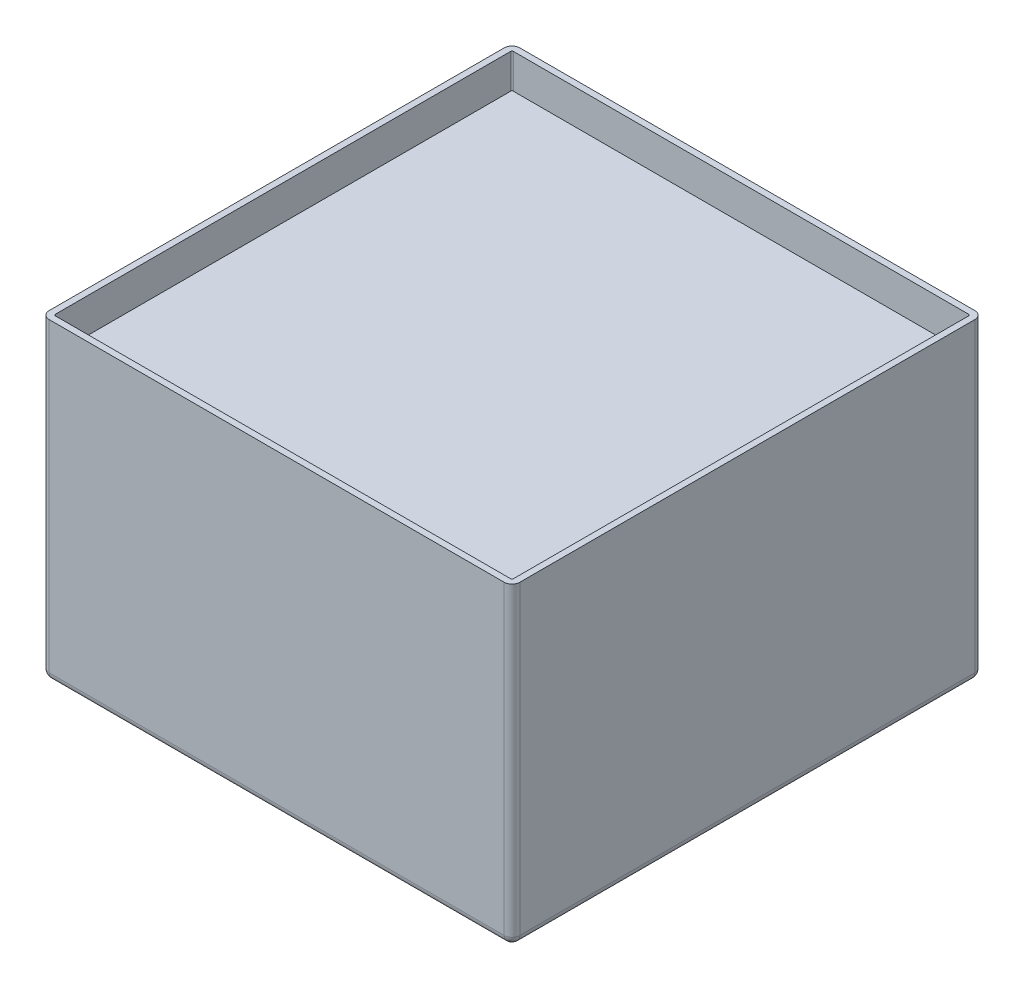
ISO-10303-21;
HEADER;
FILE_DESCRIPTION(('STEP AP214'),'2;1');
FILE_NAME('part.step','',(''),(''),'','','');
FILE_SCHEMA(('AUTOMOTIVE_DESIGN { 1 0 10303 214 1 1 1 1 }'));
ENDSEC;
DATA;
#1=APPLICATION_CONTEXT('core data for automotive mechanical design processes');
#2=APPLICATION_PROTOCOL_DEFINITION('international standard','automotive_design',2000,#1);
#3=PRODUCT_CONTEXT('',#1,'mechanical');
#4=PRODUCT('Part','Part','',(#3));
#5=PRODUCT_RELATED_PRODUCT_CATEGORY('part','',(#4));
#6=PRODUCT_DEFINITION_FORMATION('','',#4);
#7=PRODUCT_DEFINITION_CONTEXT('part definition',#1,'design');
#8=PRODUCT_DEFINITION('design','',#6,#7);
#9=PRODUCT_DEFINITION_SHAPE('','',#8);
#10=(LENGTH_UNIT() NAMED_UNIT(*) SI_UNIT(.MILLI.,.METRE.));
#11=(NAMED_UNIT(*) PLANE_ANGLE_UNIT() SI_UNIT($,.RADIAN.));
#12=(NAMED_UNIT(*) SI_UNIT($,.STERADIAN.) SOLID_ANGLE_UNIT());
#13=UNCERTAINTY_MEASURE_WITH_UNIT(LENGTH_MEASURE(1.E-05),#10,'distance_accuracy_value','');
#14=(GEOMETRIC_REPRESENTATION_CONTEXT(3) GLOBAL_UNCERTAINTY_ASSIGNED_CONTEXT((#13)) GLOBAL_UNIT_ASSIGNED_CONTEXT((#10,
#11,#12)) REPRESENTATION_CONTEXT('',''));
#15=CARTESIAN_POINT('',(0.,0.,0.));
#16=DIRECTION('',(0.,0.,1.));
#17=DIRECTION('',(1.,0.,0.));
#18=AXIS2_PLACEMENT_3D('',#15,#16,#17);
#19=CARTESIAN_POINT('',(-290.,358.,290.));
#20=DIRECTION('',(0.,0.,-1.));
#21=DIRECTION('',(-1.,0.,0.));
#22=AXIS2_PLACEMENT_3D('',#19,#20,#21);
#23=PLANE('',#22);
#24=DIRECTION('',(1.,0.,0.));
#25=VECTOR('',#24,1.);
#26=CARTESIAN_POINT('',(-290.,8.,290.));
#27=LINE('',#26,#25);
#28=CARTESIAN_POINT('',(-290.,8.,290.));
#29=VERTEX_POINT('',#28);
#30=CARTESIAN_POINT('',(290.,8.,290.));
#31=VERTEX_POINT('',#30);
#32=EDGE_CURVE('E108',#29,#31,#27,.T.);
#33=ORIENTED_EDGE('',*,*,#32,.T.);
#34=DIRECTION('',(0.,-1.,0.));
#35=VECTOR('',#34,1.);
#36=CARTESIAN_POINT('',(290.,358.,290.));
#37=LINE('',#36,#35);
#38=CARTESIAN_POINT('',(290.,358.,290.));
#39=VERTEX_POINT('',#38);
#40=EDGE_CURVE('E12',#39,#31,#37,.T.);
#41=ORIENTED_EDGE('',*,*,#40,.F.);
#42=DIRECTION('',(1.,0.,0.));
#43=VECTOR('',#42,1.);
#44=CARTESIAN_POINT('',(-290.,358.,290.));
#45=LINE('',#44,#43);
#46=CARTESIAN_POINT('',(-290.,358.,290.));
#47=VERTEX_POINT('',#46);
#48=EDGE_CURVE('E96',#47,#39,#45,.T.);
#49=ORIENTED_EDGE('',*,*,#48,.F.);
#50=DIRECTION('',(0.,-1.,0.));
#51=VECTOR('',#50,1.);
#52=CARTESIAN_POINT('',(-290.,358.,290.));
#53=LINE('',#52,#51);
#54=EDGE_CURVE('E104',#47,#29,#53,.T.);
#55=ORIENTED_EDGE('',*,*,#54,.T.);
#56=EDGE_LOOP('',(#33,#41,#49,#55));
#57=FACE_BOUND('',#56,.T.);
#58=ADVANCED_FACE('F45',(#57),#23,.F.);
#59=CARTESIAN_POINT('',(290.,358.,290.));
#60=DIRECTION('',(-1.,0.,0.));
#61=DIRECTION('',(0.,0.,1.));
#62=AXIS2_PLACEMENT_3D('',#59,#60,#61);
#63=PLANE('',#62);
#64=DIRECTION('',(0.,0.,-1.));
#65=VECTOR('',#64,1.);
#66=CARTESIAN_POINT('',(290.,8.,290.));
#67=LINE('',#66,#65);
#68=CARTESIAN_POINT('',(290.,8.,-290.));
#69=VERTEX_POINT('',#68);
#70=EDGE_CURVE('E100',#31,#69,#67,.T.);
#71=ORIENTED_EDGE('',*,*,#70,.T.);
#72=DIRECTION('',(0.,-1.,0.));
#73=VECTOR('',#72,1.);
#74=CARTESIAN_POINT('',(290.,358.,-290.));
#75=LINE('',#74,#73);
#76=CARTESIAN_POINT('',(290.,358.,-290.));
#77=VERTEX_POINT('',#76);
#78=EDGE_CURVE('E53',#77,#69,#75,.T.);
#79=ORIENTED_EDGE('',*,*,#78,.F.);
#80=DIRECTION('',(0.,0.,-1.));
#81=VECTOR('',#80,1.);
#82=CARTESIAN_POINT('',(290.,358.,290.));
#83=LINE('',#82,#81);
#84=EDGE_CURVE('E91',#39,#77,#83,.T.);
#85=ORIENTED_EDGE('',*,*,#84,.F.);
#86=ORIENTED_EDGE('',*,*,#40,.T.);
#87=EDGE_LOOP('',(#71,#79,#85,#86));
#88=FACE_BOUND('',#87,.T.);
#89=ADVANCED_FACE('F99',(#88),#63,.F.);
#90=CARTESIAN_POINT('',(290.,358.,-290.));
#91=DIRECTION('',(0.,0.,1.));
#92=DIRECTION('',(1.,0.,0.));
#93=AXIS2_PLACEMENT_3D('',#90,#91,#92);
#94=PLANE('',#93);
#95=DIRECTION('',(-1.,0.,0.));
#96=VECTOR('',#95,1.);
#97=CARTESIAN_POINT('',(290.,8.,-290.));
#98=LINE('',#97,#96);
#99=CARTESIAN_POINT('',(-290.,8.,-290.));
#100=VERTEX_POINT('',#99);
#101=EDGE_CURVE('E78',#69,#100,#98,.T.);
#102=ORIENTED_EDGE('',*,*,#101,.T.);
#103=DIRECTION('',(0.,-1.,0.));
#104=VECTOR('',#103,1.);
#105=CARTESIAN_POINT('',(-290.,358.,-290.));
#106=LINE('',#105,#104);
#107=CARTESIAN_POINT('',(-290.,358.,-290.));
#108=VERTEX_POINT('',#107);
#109=EDGE_CURVE('E101',#108,#100,#106,.T.);
#110=ORIENTED_EDGE('',*,*,#109,.F.);
#111=DIRECTION('',(-1.,0.,0.));
#112=VECTOR('',#111,1.);
#113=CARTESIAN_POINT('',(290.,358.,-290.));
#114=LINE('',#113,#112);
#115=EDGE_CURVE('E94',#77,#108,#114,.T.);
#116=ORIENTED_EDGE('',*,*,#115,.F.);
#117=ORIENTED_EDGE('',*,*,#78,.T.);
#118=EDGE_LOOP('',(#102,#110,#116,#117));
#119=FACE_BOUND('',#118,.T.);
#120=ADVANCED_FACE('F102',(#119),#94,.F.);
#121=CARTESIAN_POINT('',(-290.,358.,-290.));
#122=DIRECTION('',(1.,0.,0.));
#123=DIRECTION('',(0.,0.,-1.));
#124=AXIS2_PLACEMENT_3D('',#121,#122,#123);
#125=PLANE('',#124);
#126=DIRECTION('',(0.,0.,1.));
#127=VECTOR('',#126,1.);
#128=CARTESIAN_POINT('',(-290.,8.,-290.));
#129=LINE('',#128,#127);
#130=EDGE_CURVE('E84',#100,#29,#129,.T.);
#131=ORIENTED_EDGE('',*,*,#130,.T.);
#132=ORIENTED_EDGE('',*,*,#54,.F.);
#133=DIRECTION('',(0.,0.,1.));
#134=VECTOR('',#133,1.);
#135=CARTESIAN_POINT('',(-290.,358.,-290.));
#136=LINE('',#135,#134);
#137=EDGE_CURVE('E61',#108,#47,#136,.T.);
#138=ORIENTED_EDGE('',*,*,#137,.F.);
#139=ORIENTED_EDGE('',*,*,#109,.T.);
#140=EDGE_LOOP('',(#131,#132,#138,#139));
#141=FACE_BOUND('',#140,.T.);
#142=ADVANCED_FACE('F115',(#141),#125,.F.);
#143=CARTESIAN_POINT('',(290.,358.,290.));
#144=DIRECTION('',(0.,1.,0.));
#145=DIRECTION('',(0.,0.,1.));
#146=AXIS2_PLACEMENT_3D('',#143,#144,#145);
#147=PLANE('',#146);
#148=ORIENTED_EDGE('',*,*,#48,.T.);
#149=ORIENTED_EDGE('',*,*,#84,.T.);
#150=ORIENTED_EDGE('',*,*,#115,.T.);
#151=ORIENTED_EDGE('',*,*,#137,.T.);
#152=EDGE_LOOP('',(#148,#149,#150,#151));
#153=FACE_BOUND('',#152,.T.);
#154=ADVANCED_FACE('F92',(#153),#147,.T.);
#155=CARTESIAN_POINT('',(290.,8.,290.));
#156=DIRECTION('',(0.,1.,0.));
#157=DIRECTION('',(0.,0.,1.));
#158=AXIS2_PLACEMENT_3D('',#155,#156,#157);
#159=PLANE('',#158);
#160=ORIENTED_EDGE('',*,*,#32,.F.);
#161=ORIENTED_EDGE('',*,*,#130,.F.);
#162=ORIENTED_EDGE('',*,*,#101,.F.);
#163=ORIENTED_EDGE('',*,*,#70,.F.);
#164=EDGE_LOOP('',(#160,#161,#162,#163));
#165=FACE_BOUND('',#164,.T.);
#166=ADVANCED_FACE('F118',(#165),#159,.F.);
#167=CLOSED_SHELL('',(#58,#89,#120,#142,#154,#166));
#168=MANIFOLD_SOLID_BREP('B2',#167);
#169=CARTESIAN_POINT('',(-300.,400.,300.));
#170=DIRECTION('',(1.,0.,0.));
#171=DIRECTION('',(0.,0.,-1.));
#172=AXIS2_PLACEMENT_3D('',#169,#170,#171);
#173=PLANE('',#172);
#174=DIRECTION('',(0.,0.,1.));
#175=VECTOR('',#174,1.);
#176=CARTESIAN_POINT('',(-300.,400.,300.));
#177=LINE('',#176,#175);
#178=CARTESIAN_POINT('',(-300.,400.,-290.));
#179=VERTEX_POINT('',#178);
#180=CARTESIAN_POINT('',(-300.,400.,290.));
#181=VERTEX_POINT('',#180);
#182=EDGE_CURVE('E414',#179,#181,#177,.T.);
#183=ORIENTED_EDGE('',*,*,#182,.F.);
#184=DIRECTION('',(0.,-1.,0.));
#185=VECTOR('',#184,1.);
#186=CARTESIAN_POINT('',(-300.,400.,-290.));
#187=LINE('',#186,#185);
#188=CARTESIAN_POINT('',(-300.,10.,-290.));
#189=VERTEX_POINT('',#188);
#190=EDGE_CURVE('E194',#179,#189,#187,.T.);
#191=ORIENTED_EDGE('',*,*,#190,.T.);
#192=DIRECTION('',(0.,0.,1.));
#193=VECTOR('',#192,1.);
#194=CARTESIAN_POINT('',(-300.,10.,300.));
#195=LINE('',#194,#193);
#196=CARTESIAN_POINT('',(-300.,10.,290.));
#197=VERTEX_POINT('',#196);
#198=EDGE_CURVE('E456',#189,#197,#195,.T.);
#199=ORIENTED_EDGE('',*,*,#198,.T.);
#200=DIRECTION('',(0.,-1.,0.));
#201=VECTOR('',#200,1.);
#202=CARTESIAN_POINT('',(-300.,400.,290.));
#203=LINE('',#202,#201);
#204=EDGE_CURVE('E454',#197,#181,#203,.F.);
#205=ORIENTED_EDGE('',*,*,#204,.T.);
#206=EDGE_LOOP('',(#183,#191,#199,#205));
#207=FACE_BOUND('',#206,.T.);
#208=ADVANCED_FACE('F169',(#207),#173,.F.);
#209=CARTESIAN_POINT('',(300.,400.,300.));
#210=DIRECTION('',(0.,0.,-1.));
#211=DIRECTION('',(-1.,0.,0.));
#212=AXIS2_PLACEMENT_3D('',#209,#210,#211);
#213=PLANE('',#212);
#214=DIRECTION('',(1.,0.,0.));
#215=VECTOR('',#214,1.);
#216=CARTESIAN_POINT('',(300.,10.,300.));
#217=LINE('',#216,#215);
#218=CARTESIAN_POINT('',(-290.,10.,300.));
#219=VERTEX_POINT('',#218);
#220=CARTESIAN_POINT('',(290.,10.,300.));
#221=VERTEX_POINT('',#220);
#222=EDGE_CURVE('E428',#219,#221,#217,.T.);
#223=ORIENTED_EDGE('',*,*,#222,.T.);
#224=DIRECTION('',(0.,-1.,0.));
#225=VECTOR('',#224,1.);
#226=CARTESIAN_POINT('',(290.,400.,300.));
#227=LINE('',#226,#225);
#228=CARTESIAN_POINT('',(290.,400.,300.));
#229=VERTEX_POINT('',#228);
#230=EDGE_CURVE('E431',#221,#229,#227,.F.);
#231=ORIENTED_EDGE('',*,*,#230,.T.);
#232=DIRECTION('',(1.,0.,0.));
#233=VECTOR('',#232,1.);
#234=CARTESIAN_POINT('',(300.,400.,300.));
#235=LINE('',#234,#233);
#236=CARTESIAN_POINT('',(-290.,400.,300.));
#237=VERTEX_POINT('',#236);
#238=EDGE_CURVE('E417',#237,#229,#235,.T.);
#239=ORIENTED_EDGE('',*,*,#238,.F.);
#240=DIRECTION('',(0.,-1.,0.));
#241=VECTOR('',#240,1.);
#242=CARTESIAN_POINT('',(-290.,400.,300.));
#243=LINE('',#242,#241);
#244=EDGE_CURVE('E426',#237,#219,#243,.T.);
#245=ORIENTED_EDGE('',*,*,#244,.T.);
#246=EDGE_LOOP('',(#223,#231,#239,#245));
#247=FACE_BOUND('',#246,.T.);
#248=ADVANCED_FACE('F517',(#247),#213,.F.);
#249=CARTESIAN_POINT('',(300.,400.,300.));
#250=DIRECTION('',(-1.,0.,0.));
#251=DIRECTION('',(0.,0.,1.));
#252=AXIS2_PLACEMENT_3D('',#249,#250,#251);
#253=PLANE('',#252);
#254=DIRECTION('',(0.,0.,-1.));
#255=VECTOR('',#254,1.);
#256=CARTESIAN_POINT('',(300.,10.,300.));
#257=LINE('',#256,#255);
#258=CARTESIAN_POINT('',(300.,10.,290.));
#259=VERTEX_POINT('',#258);
#260=CARTESIAN_POINT('',(300.,10.,-290.));
#261=VERTEX_POINT('',#260);
#262=EDGE_CURVE('E444',#259,#261,#257,.T.);
#263=ORIENTED_EDGE('',*,*,#262,.T.);
#264=DIRECTION('',(0.,-1.,0.));
#265=VECTOR('',#264,1.);
#266=CARTESIAN_POINT('',(300.,400.,-290.));
#267=LINE('',#266,#265);
#268=CARTESIAN_POINT('',(300.,400.,-290.));
#269=VERTEX_POINT('',#268);
#270=EDGE_CURVE('E446',#261,#269,#267,.F.);
#271=ORIENTED_EDGE('',*,*,#270,.T.);
#272=DIRECTION('',(0.,0.,-1.));
#273=VECTOR('',#272,1.);
#274=CARTESIAN_POINT('',(300.,400.,300.));
#275=LINE('',#274,#273);
#276=CARTESIAN_POINT('',(300.,400.,290.));
#277=VERTEX_POINT('',#276);
#278=EDGE_CURVE('E420',#277,#269,#275,.T.);
#279=ORIENTED_EDGE('',*,*,#278,.F.);
#280=DIRECTION('',(0.,-1.,0.));
#281=VECTOR('',#280,1.);
#282=CARTESIAN_POINT('',(300.,400.,290.));
#283=LINE('',#282,#281);
#284=EDGE_CURVE('E442',#277,#259,#283,.T.);
#285=ORIENTED_EDGE('',*,*,#284,.T.);
#286=EDGE_LOOP('',(#263,#271,#279,#285));
#287=FACE_BOUND('',#286,.T.);
#288=ADVANCED_FACE('F527',(#287),#253,.F.);
#289=CARTESIAN_POINT('',(300.,400.,-300.));
#290=DIRECTION('',(0.,0.,1.));
#291=DIRECTION('',(1.,0.,0.));
#292=AXIS2_PLACEMENT_3D('',#289,#290,#291);
#293=PLANE('',#292);
#294=DIRECTION('',(-1.,0.,0.));
#295=VECTOR('',#294,1.);
#296=CARTESIAN_POINT('',(300.,10.,-300.));
#297=LINE('',#296,#295);
#298=CARTESIAN_POINT('',(290.,10.,-300.));
#299=VERTEX_POINT('',#298);
#300=CARTESIAN_POINT('',(-290.,10.,-300.));
#301=VERTEX_POINT('',#300);
#302=EDGE_CURVE('E450',#299,#301,#297,.T.);
#303=ORIENTED_EDGE('',*,*,#302,.T.);
#304=DIRECTION('',(0.,-1.,0.));
#305=VECTOR('',#304,1.);
#306=CARTESIAN_POINT('',(-290.,400.,-300.));
#307=LINE('',#306,#305);
#308=CARTESIAN_POINT('',(-290.,400.,-300.));
#309=VERTEX_POINT('',#308);
#310=EDGE_CURVE('E452',#301,#309,#307,.F.);
#311=ORIENTED_EDGE('',*,*,#310,.T.);
#312=DIRECTION('',(-1.,0.,0.));
#313=VECTOR('',#312,1.);
#314=CARTESIAN_POINT('',(300.,400.,-300.));
#315=LINE('',#314,#313);
#316=CARTESIAN_POINT('',(290.,400.,-300.));
#317=VERTEX_POINT('',#316);
#318=EDGE_CURVE('E423',#317,#309,#315,.T.);
#319=ORIENTED_EDGE('',*,*,#318,.F.);
#320=DIRECTION('',(0.,-1.,0.));
#321=VECTOR('',#320,1.);
#322=CARTESIAN_POINT('',(290.,400.,-300.));
#323=LINE('',#322,#321);
#324=EDGE_CURVE('E448',#317,#299,#323,.T.);
#325=ORIENTED_EDGE('',*,*,#324,.T.);
#326=EDGE_LOOP('',(#303,#311,#319,#325));
#327=FACE_BOUND('',#326,.T.);
#328=ADVANCED_FACE('F548',(#327),#293,.F.);
#329=CARTESIAN_POINT('',(-300.,400.,-300.));
#330=DIRECTION('',(0.,1.,0.));
#331=DIRECTION('',(0.,0.,1.));
#332=AXIS2_PLACEMENT_3D('',#329,#330,#331);
#333=PLANE('',#332);
#334=DIRECTION('',(-1.,0.,0.));
#335=VECTOR('',#334,1.);
#336=CARTESIAN_POINT('',(300.,400.,-292.));
#337=LINE('',#336,#335);
#338=CARTESIAN_POINT('',(290.,400.,-292.));
#339=VERTEX_POINT('',#338);
#340=CARTESIAN_POINT('',(-290.,400.,-292.));
#341=VERTEX_POINT('',#340);
#342=EDGE_CURVE('E387',#339,#341,#337,.T.);
#343=ORIENTED_EDGE('',*,*,#342,.F.);
#344=CARTESIAN_POINT('',(290.,400.,-290.));
#345=DIRECTION('',(0.,1.,0.));
#346=DIRECTION('',(0.,0.,1.));
#347=AXIS2_PLACEMENT_3D('',#344,#345,#346);
#348=CIRCLE('',#347,2.);
#349=CARTESIAN_POINT('',(292.,400.,-290.));
#350=VERTEX_POINT('',#349);
#351=EDGE_CURVE('E407',#350,#339,#348,.T.);
#352=ORIENTED_EDGE('',*,*,#351,.F.);
#353=DIRECTION('',(0.,0.,-1.));
#354=VECTOR('',#353,1.);
#355=CARTESIAN_POINT('',(292.,400.,300.));
#356=LINE('',#355,#354);
#357=CARTESIAN_POINT('',(292.,400.,290.));
#358=VERTEX_POINT('',#357);
#359=EDGE_CURVE('E186',#358,#350,#356,.T.);
#360=ORIENTED_EDGE('',*,*,#359,.F.);
#361=CARTESIAN_POINT('',(290.,400.,290.));
#362=DIRECTION('',(0.,1.,0.));
#363=DIRECTION('',(0.,0.,1.));
#364=AXIS2_PLACEMENT_3D('',#361,#362,#363);
#365=CIRCLE('',#364,2.);
#366=CARTESIAN_POINT('',(290.,400.,292.));
#367=VERTEX_POINT('',#366);
#368=EDGE_CURVE('E403',#367,#358,#365,.T.);
#369=ORIENTED_EDGE('',*,*,#368,.F.);
#370=DIRECTION('',(1.,0.,0.));
#371=VECTOR('',#370,1.);
#372=CARTESIAN_POINT('',(300.,400.,292.));
#373=LINE('',#372,#371);
#374=CARTESIAN_POINT('',(-290.,400.,292.));
#375=VERTEX_POINT('',#374);
#376=EDGE_CURVE('E401',#375,#367,#373,.T.);
#377=ORIENTED_EDGE('',*,*,#376,.F.);
#378=CARTESIAN_POINT('',(-290.,400.,290.));
#379=DIRECTION('',(0.,1.,0.));
#380=DIRECTION('',(0.,0.,1.));
#381=AXIS2_PLACEMENT_3D('',#378,#379,#380);
#382=CIRCLE('',#381,2.);
#383=CARTESIAN_POINT('',(-292.,400.,290.));
#384=VERTEX_POINT('',#383);
#385=EDGE_CURVE('E320',#384,#375,#382,.T.);
#386=ORIENTED_EDGE('',*,*,#385,.F.);
#387=DIRECTION('',(0.,0.,1.));
#388=VECTOR('',#387,1.);
#389=CARTESIAN_POINT('',(-292.,400.,300.));
#390=LINE('',#389,#388);
#391=CARTESIAN_POINT('',(-292.,400.,-290.));
#392=VERTEX_POINT('',#391);
#393=EDGE_CURVE('E377',#392,#384,#390,.T.);
#394=ORIENTED_EDGE('',*,*,#393,.F.);
#395=CARTESIAN_POINT('',(-290.,400.,-290.));
#396=DIRECTION('',(0.,1.,0.));
#397=DIRECTION('',(0.,0.,1.));
#398=AXIS2_PLACEMENT_3D('',#395,#396,#397);
#399=CIRCLE('',#398,2.);
#400=EDGE_CURVE('E315',#341,#392,#399,.T.);
#401=ORIENTED_EDGE('',*,*,#400,.F.);
#402=EDGE_LOOP('',(#343,#352,#360,#369,#377,#386,#394,#401));
#403=FACE_BOUND('',#402,.T.);
#404=ORIENTED_EDGE('',*,*,#318,.T.);
#405=CARTESIAN_POINT('',(-290.,400.,-290.));
#406=DIRECTION('',(0.,1.,0.));
#407=DIRECTION('',(0.,0.,1.));
#408=AXIS2_PLACEMENT_3D('',#405,#406,#407);
#409=CIRCLE('',#408,10.);
#410=EDGE_CURVE('E43',#309,#179,#409,.T.);
#411=ORIENTED_EDGE('',*,*,#410,.T.);
#412=ORIENTED_EDGE('',*,*,#182,.T.);
#413=CARTESIAN_POINT('',(-290.,400.,290.));
#414=DIRECTION('',(0.,1.,0.));
#415=DIRECTION('',(0.,0.,1.));
#416=AXIS2_PLACEMENT_3D('',#413,#414,#415);
#417=CIRCLE('',#416,10.);
#418=EDGE_CURVE('E459',#181,#237,#417,.T.);
#419=ORIENTED_EDGE('',*,*,#418,.T.);
#420=ORIENTED_EDGE('',*,*,#238,.T.);
#421=CARTESIAN_POINT('',(290.,400.,290.));
#422=DIRECTION('',(0.,1.,0.));
#423=DIRECTION('',(0.,0.,1.));
#424=AXIS2_PLACEMENT_3D('',#421,#422,#423);
#425=CIRCLE('',#424,10.);
#426=EDGE_CURVE('E461',#229,#277,#425,.T.);
#427=ORIENTED_EDGE('',*,*,#426,.T.);
#428=ORIENTED_EDGE('',*,*,#278,.T.);
#429=CARTESIAN_POINT('',(290.,400.,-290.));
#430=DIRECTION('',(0.,1.,0.));
#431=DIRECTION('',(0.,0.,1.));
#432=AXIS2_PLACEMENT_3D('',#429,#430,#431);
#433=CIRCLE('',#432,10.);
#434=EDGE_CURVE('E178',#269,#317,#433,.T.);
#435=ORIENTED_EDGE('',*,*,#434,.T.);
#436=EDGE_LOOP('',(#404,#411,#412,#419,#420,#427,#428,#435));
#437=FACE_BOUND('',#436,.T.);
#438=ADVANCED_FACE('F514',(#403,#437),#333,.T.);
#439=CARTESIAN_POINT('',(-300.,0.,-300.));
#440=DIRECTION('',(0.,1.,0.));
#441=DIRECTION('',(0.,0.,1.));
#442=AXIS2_PLACEMENT_3D('',#439,#440,#441);
#443=PLANE('',#442);
#444=DIRECTION('',(0.,0.,-1.));
#445=VECTOR('',#444,1.);
#446=CARTESIAN_POINT('',(290.,0.,-300.));
#447=LINE('',#446,#445);
#448=CARTESIAN_POINT('',(290.,0.,-290.));
#449=VERTEX_POINT('',#448);
#450=CARTESIAN_POINT('',(290.,0.,290.));
#451=VERTEX_POINT('',#450);
#452=EDGE_CURVE('E437',#449,#451,#447,.F.);
#453=ORIENTED_EDGE('',*,*,#452,.T.);
#454=DIRECTION('',(1.,0.,0.));
#455=VECTOR('',#454,1.);
#456=CARTESIAN_POINT('',(-300.,0.,290.));
#457=LINE('',#456,#455);
#458=CARTESIAN_POINT('',(-290.,0.,290.));
#459=VERTEX_POINT('',#458);
#460=EDGE_CURVE('E439',#451,#459,#457,.F.);
#461=ORIENTED_EDGE('',*,*,#460,.T.);
#462=DIRECTION('',(0.,0.,1.));
#463=VECTOR('',#462,1.);
#464=CARTESIAN_POINT('',(-290.,0.,-300.));
#465=LINE('',#464,#463);
#466=CARTESIAN_POINT('',(-290.,0.,-290.));
#467=VERTEX_POINT('',#466);
#468=EDGE_CURVE('E433',#459,#467,#465,.F.);
#469=ORIENTED_EDGE('',*,*,#468,.T.);
#470=DIRECTION('',(-1.,0.,0.));
#471=VECTOR('',#470,1.);
#472=CARTESIAN_POINT('',(-300.,0.,-290.));
#473=LINE('',#472,#471);
#474=EDGE_CURVE('E435',#467,#449,#473,.F.);
#475=ORIENTED_EDGE('',*,*,#474,.T.);
#476=EDGE_LOOP('',(#453,#461,#469,#475));
#477=FACE_BOUND('',#476,.T.);
#478=ADVANCED_FACE('F544',(#477),#443,.F.);
#479=CARTESIAN_POINT('',(-290.,400.,-290.));
#480=DIRECTION('',(0.,-1.,0.));
#481=DIRECTION('',(0.,0.,-1.));
#482=AXIS2_PLACEMENT_3D('',#479,#480,#481);
#483=CYLINDRICAL_SURFACE('',#482,10.);
#484=ORIENTED_EDGE('',*,*,#410,.F.);
#485=ORIENTED_EDGE('',*,*,#310,.F.);
#486=CARTESIAN_POINT('',(-290.,10.,-290.));
#487=DIRECTION('',(0.,-1.,0.));
#488=DIRECTION('',(0.,0.,-1.));
#489=AXIS2_PLACEMENT_3D('',#486,#487,#488);
#490=CIRCLE('',#489,10.);
#491=EDGE_CURVE('E490',#189,#301,#490,.T.);
#492=ORIENTED_EDGE('',*,*,#491,.F.);
#493=ORIENTED_EDGE('',*,*,#190,.F.);
#494=EDGE_LOOP('',(#484,#485,#492,#493));
#495=FACE_BOUND('',#494,.T.);
#496=ADVANCED_FACE('F171',(#495),#483,.T.);
#497=CARTESIAN_POINT('',(290.,400.,-290.));
#498=DIRECTION('',(0.,-1.,0.));
#499=DIRECTION('',(0.,0.,-1.));
#500=AXIS2_PLACEMENT_3D('',#497,#498,#499);
#501=CYLINDRICAL_SURFACE('',#500,10.);
#502=ORIENTED_EDGE('',*,*,#434,.F.);
#503=ORIENTED_EDGE('',*,*,#270,.F.);
#504=CARTESIAN_POINT('',(290.,10.,-290.));
#505=DIRECTION('',(0.,-1.,0.));
#506=DIRECTION('',(0.,0.,-1.));
#507=AXIS2_PLACEMENT_3D('',#504,#505,#506);
#508=CIRCLE('',#507,10.);
#509=EDGE_CURVE('E488',#299,#261,#508,.T.);
#510=ORIENTED_EDGE('',*,*,#509,.F.);
#511=ORIENTED_EDGE('',*,*,#324,.F.);
#512=EDGE_LOOP('',(#502,#503,#510,#511));
#513=FACE_BOUND('',#512,.T.);
#514=ADVANCED_FACE('F532',(#513),#501,.T.);
#515=CARTESIAN_POINT('',(300.,10.,-290.));
#516=DIRECTION('',(-1.,0.,0.));
#517=DIRECTION('',(0.,0.,1.));
#518=AXIS2_PLACEMENT_3D('',#515,#516,#517);
#519=CYLINDRICAL_SURFACE('',#518,10.);
#520=CARTESIAN_POINT('',(-290.,10.,-290.));
#521=DIRECTION('',(-1.,0.,0.));
#522=DIRECTION('',(0.,0.,1.));
#523=AXIS2_PLACEMENT_3D('',#520,#521,#522);
#524=CIRCLE('',#523,10.);
#525=EDGE_CURVE('E173',#301,#467,#524,.T.);
#526=ORIENTED_EDGE('',*,*,#525,.F.);
#527=ORIENTED_EDGE('',*,*,#302,.F.);
#528=CARTESIAN_POINT('',(290.,10.,-290.));
#529=DIRECTION('',(1.,0.,0.));
#530=DIRECTION('',(0.,0.,-1.));
#531=AXIS2_PLACEMENT_3D('',#528,#529,#530);
#532=CIRCLE('',#531,10.);
#533=EDGE_CURVE('E485',#449,#299,#532,.T.);
#534=ORIENTED_EDGE('',*,*,#533,.F.);
#535=ORIENTED_EDGE('',*,*,#474,.F.);
#536=EDGE_LOOP('',(#526,#527,#534,#535));
#537=FACE_BOUND('',#536,.T.);
#538=ADVANCED_FACE('F545',(#537),#519,.T.);
#539=CARTESIAN_POINT('',(-290.,10.,-290.));
#540=DIRECTION('',(0.,0.,1.));
#541=DIRECTION('',(1.,0.,0.));
#542=AXIS2_PLACEMENT_3D('',#539,#540,#541);
#543=SPHERICAL_SURFACE('',#542,10.);
#544=ORIENTED_EDGE('',*,*,#491,.T.);
#545=ORIENTED_EDGE('',*,*,#525,.T.);
#546=CARTESIAN_POINT('',(-290.,10.,-290.));
#547=DIRECTION('',(0.,0.,-1.));
#548=DIRECTION('',(-1.,0.,0.));
#549=AXIS2_PLACEMENT_3D('',#546,#547,#548);
#550=CIRCLE('',#549,10.);
#551=EDGE_CURVE('E482',#189,#467,#550,.F.);
#552=ORIENTED_EDGE('',*,*,#551,.F.);
#553=EDGE_LOOP('',(#544,#545,#552));
#554=FACE_BOUND('',#553,.T.);
#555=ADVANCED_FACE('F496',(#554),#543,.T.);
#556=CARTESIAN_POINT('',(290.,10.,-290.));
#557=DIRECTION('',(0.,0.,1.));
#558=DIRECTION('',(1.,0.,0.));
#559=AXIS2_PLACEMENT_3D('',#556,#557,#558);
#560=SPHERICAL_SURFACE('',#559,10.);
#561=ORIENTED_EDGE('',*,*,#533,.T.);
#562=ORIENTED_EDGE('',*,*,#509,.T.);
#563=CARTESIAN_POINT('',(290.,10.,-290.));
#564=DIRECTION('',(0.,0.,-1.));
#565=DIRECTION('',(-1.,0.,0.));
#566=AXIS2_PLACEMENT_3D('',#563,#564,#565);
#567=CIRCLE('',#566,10.);
#568=EDGE_CURVE('E479',#449,#261,#567,.F.);
#569=ORIENTED_EDGE('',*,*,#568,.F.);
#570=EDGE_LOOP('',(#561,#562,#569));
#571=FACE_BOUND('',#570,.T.);
#572=ADVANCED_FACE('F536',(#571),#560,.T.);
#573=CARTESIAN_POINT('',(-290.,10.,300.));
#574=DIRECTION('',(0.,0.,1.));
#575=DIRECTION('',(1.,0.,0.));
#576=AXIS2_PLACEMENT_3D('',#573,#574,#575);
#577=CYLINDRICAL_SURFACE('',#576,10.);
#578=ORIENTED_EDGE('',*,*,#551,.T.);
#579=ORIENTED_EDGE('',*,*,#468,.F.);
#580=CARTESIAN_POINT('',(-290.,10.,290.));
#581=DIRECTION('',(0.,0.,1.));
#582=DIRECTION('',(1.,0.,0.));
#583=AXIS2_PLACEMENT_3D('',#580,#581,#582);
#584=CIRCLE('',#583,10.);
#585=EDGE_CURVE('E476',#197,#459,#584,.T.);
#586=ORIENTED_EDGE('',*,*,#585,.F.);
#587=ORIENTED_EDGE('',*,*,#198,.F.);
#588=EDGE_LOOP('',(#578,#579,#586,#587));
#589=FACE_BOUND('',#588,.T.);
#590=ADVANCED_FACE('F503',(#589),#577,.T.);
#591=CARTESIAN_POINT('',(-290.,400.,290.));
#592=DIRECTION('',(0.,-1.,0.));
#593=DIRECTION('',(0.,0.,-1.));
#594=AXIS2_PLACEMENT_3D('',#591,#592,#593);
#595=CYLINDRICAL_SURFACE('',#594,10.);
#596=ORIENTED_EDGE('',*,*,#418,.F.);
#597=ORIENTED_EDGE('',*,*,#204,.F.);
#598=CARTESIAN_POINT('',(-290.,10.,290.));
#599=DIRECTION('',(0.,-1.,0.));
#600=DIRECTION('',(0.,0.,-1.));
#601=AXIS2_PLACEMENT_3D('',#598,#599,#600);
#602=CIRCLE('',#601,10.);
#603=EDGE_CURVE('E473',#219,#197,#602,.T.);
#604=ORIENTED_EDGE('',*,*,#603,.F.);
#605=ORIENTED_EDGE('',*,*,#244,.F.);
#606=EDGE_LOOP('',(#596,#597,#604,#605));
#607=FACE_BOUND('',#606,.T.);
#608=ADVANCED_FACE('F509',(#607),#595,.T.);
#609=CARTESIAN_POINT('',(290.,400.,290.));
#610=DIRECTION('',(0.,-1.,0.));
#611=DIRECTION('',(0.,0.,-1.));
#612=AXIS2_PLACEMENT_3D('',#609,#610,#611);
#613=CYLINDRICAL_SURFACE('',#612,10.);
#614=ORIENTED_EDGE('',*,*,#426,.F.);
#615=ORIENTED_EDGE('',*,*,#230,.F.);
#616=CARTESIAN_POINT('',(290.,10.,290.));
#617=DIRECTION('',(0.,-1.,0.));
#618=DIRECTION('',(0.,0.,-1.));
#619=AXIS2_PLACEMENT_3D('',#616,#617,#618);
#620=CIRCLE('',#619,10.);
#621=EDGE_CURVE('E470',#259,#221,#620,.T.);
#622=ORIENTED_EDGE('',*,*,#621,.F.);
#623=ORIENTED_EDGE('',*,*,#284,.F.);
#624=EDGE_LOOP('',(#614,#615,#622,#623));
#625=FACE_BOUND('',#624,.T.);
#626=ADVANCED_FACE('F522',(#625),#613,.T.);
#627=CARTESIAN_POINT('',(290.,10.,300.));
#628=DIRECTION('',(0.,0.,-1.));
#629=DIRECTION('',(-1.,0.,0.));
#630=AXIS2_PLACEMENT_3D('',#627,#628,#629);
#631=CYLINDRICAL_SURFACE('',#630,10.);
#632=ORIENTED_EDGE('',*,*,#568,.T.);
#633=ORIENTED_EDGE('',*,*,#262,.F.);
#634=CARTESIAN_POINT('',(290.,10.,290.));
#635=DIRECTION('',(0.,0.,1.));
#636=DIRECTION('',(1.,0.,0.));
#637=AXIS2_PLACEMENT_3D('',#634,#635,#636);
#638=CIRCLE('',#637,10.);
#639=EDGE_CURVE('E467',#451,#259,#638,.T.);
#640=ORIENTED_EDGE('',*,*,#639,.F.);
#641=ORIENTED_EDGE('',*,*,#452,.F.);
#642=EDGE_LOOP('',(#632,#633,#640,#641));
#643=FACE_BOUND('',#642,.T.);
#644=ADVANCED_FACE('F540',(#643),#631,.T.);
#645=CARTESIAN_POINT('',(-290.,10.,290.));
#646=DIRECTION('',(0.,0.,1.));
#647=DIRECTION('',(1.,0.,0.));
#648=AXIS2_PLACEMENT_3D('',#645,#646,#647);
#649=SPHERICAL_SURFACE('',#648,10.);
#650=ORIENTED_EDGE('',*,*,#603,.T.);
#651=ORIENTED_EDGE('',*,*,#585,.T.);
#652=CARTESIAN_POINT('',(-290.,10.,290.));
#653=DIRECTION('',(-1.,0.,0.));
#654=DIRECTION('',(0.,0.,1.));
#655=AXIS2_PLACEMENT_3D('',#652,#653,#654);
#656=CIRCLE('',#655,10.);
#657=EDGE_CURVE('E465',#219,#459,#656,.F.);
#658=ORIENTED_EDGE('',*,*,#657,.F.);
#659=EDGE_LOOP('',(#650,#651,#658));
#660=FACE_BOUND('',#659,.T.);
#661=ADVANCED_FACE('F573',(#660),#649,.T.);
#662=CARTESIAN_POINT('',(290.,10.,290.));
#663=DIRECTION('',(0.,0.,1.));
#664=DIRECTION('',(1.,0.,0.));
#665=AXIS2_PLACEMENT_3D('',#662,#663,#664);
#666=SPHERICAL_SURFACE('',#665,10.);
#667=ORIENTED_EDGE('',*,*,#639,.T.);
#668=ORIENTED_EDGE('',*,*,#621,.T.);
#669=CARTESIAN_POINT('',(290.,10.,290.));
#670=DIRECTION('',(1.,0.,0.));
#671=DIRECTION('',(0.,0.,-1.));
#672=AXIS2_PLACEMENT_3D('',#669,#670,#671);
#673=CIRCLE('',#672,10.);
#674=EDGE_CURVE('E413',#451,#221,#673,.F.);
#675=ORIENTED_EDGE('',*,*,#674,.F.);
#676=EDGE_LOOP('',(#667,#668,#675));
#677=FACE_BOUND('',#676,.T.);
#678=ADVANCED_FACE('F569',(#677),#666,.T.);
#679=CARTESIAN_POINT('',(300.,10.,290.));
#680=DIRECTION('',(1.,0.,0.));
#681=DIRECTION('',(0.,0.,-1.));
#682=AXIS2_PLACEMENT_3D('',#679,#680,#681);
#683=CYLINDRICAL_SURFACE('',#682,10.);
#684=ORIENTED_EDGE('',*,*,#657,.T.);
#685=ORIENTED_EDGE('',*,*,#460,.F.);
#686=ORIENTED_EDGE('',*,*,#674,.T.);
#687=ORIENTED_EDGE('',*,*,#222,.F.);
#688=EDGE_LOOP('',(#684,#685,#686,#687));
#689=FACE_BOUND('',#688,.T.);
#690=ADVANCED_FACE('F566',(#689),#683,.T.);
#691=CARTESIAN_POINT('',(-292.,400.,300.));
#692=DIRECTION('',(1.,0.,0.));
#693=DIRECTION('',(0.,0.,-1.));
#694=AXIS2_PLACEMENT_3D('',#691,#692,#693);
#695=PLANE('',#694);
#696=ORIENTED_EDGE('',*,*,#393,.T.);
#697=DIRECTION('',(0.,1.,0.));
#698=VECTOR('',#697,1.);
#699=CARTESIAN_POINT('',(-292.,400.,290.));
#700=LINE('',#699,#698);
#701=CARTESIAN_POINT('',(-292.,10.,290.));
#702=VERTEX_POINT('',#701);
#703=EDGE_CURVE('E344',#702,#384,#700,.T.);
#704=ORIENTED_EDGE('',*,*,#703,.F.);
#705=DIRECTION('',(0.,0.,-1.));
#706=VECTOR('',#705,1.);
#707=CARTESIAN_POINT('',(-292.,10.,300.));
#708=LINE('',#707,#706);
#709=CARTESIAN_POINT('',(-292.,10.,-290.));
#710=VERTEX_POINT('',#709);
#711=EDGE_CURVE('E321',#710,#702,#708,.F.);
#712=ORIENTED_EDGE('',*,*,#711,.F.);
#713=DIRECTION('',(0.,1.,0.));
#714=VECTOR('',#713,1.);
#715=CARTESIAN_POINT('',(-292.,400.,-290.));
#716=LINE('',#715,#714);
#717=EDGE_CURVE('E310',#392,#710,#716,.F.);
#718=ORIENTED_EDGE('',*,*,#717,.F.);
#719=EDGE_LOOP('',(#696,#704,#712,#718));
#720=FACE_BOUND('',#719,.T.);
#721=ADVANCED_FACE('F343',(#720),#695,.T.);
#722=CARTESIAN_POINT('',(300.,400.,292.));
#723=DIRECTION('',(0.,0.,-1.));
#724=DIRECTION('',(-1.,0.,0.));
#725=AXIS2_PLACEMENT_3D('',#722,#723,#724);
#726=PLANE('',#725);
#727=DIRECTION('',(-1.,0.,0.));
#728=VECTOR('',#727,1.);
#729=CARTESIAN_POINT('',(300.,10.,292.));
#730=LINE('',#729,#728);
#731=CARTESIAN_POINT('',(-290.,10.,292.));
#732=VERTEX_POINT('',#731);
#733=CARTESIAN_POINT('',(290.,10.,292.));
#734=VERTEX_POINT('',#733);
#735=EDGE_CURVE('E386',#732,#734,#730,.F.);
#736=ORIENTED_EDGE('',*,*,#735,.F.);
#737=DIRECTION('',(0.,1.,0.));
#738=VECTOR('',#737,1.);
#739=CARTESIAN_POINT('',(-290.,400.,292.));
#740=LINE('',#739,#738);
#741=EDGE_CURVE('E384',#375,#732,#740,.F.);
#742=ORIENTED_EDGE('',*,*,#741,.F.);
#743=ORIENTED_EDGE('',*,*,#376,.T.);
#744=DIRECTION('',(0.,1.,0.));
#745=VECTOR('',#744,1.);
#746=CARTESIAN_POINT('',(290.,400.,292.));
#747=LINE('',#746,#745);
#748=EDGE_CURVE('E375',#734,#367,#747,.T.);
#749=ORIENTED_EDGE('',*,*,#748,.F.);
#750=EDGE_LOOP('',(#736,#742,#743,#749));
#751=FACE_BOUND('',#750,.T.);
#752=ADVANCED_FACE('F638',(#751),#726,.T.);
#753=CARTESIAN_POINT('',(292.,400.,300.));
#754=DIRECTION('',(-1.,0.,0.));
#755=DIRECTION('',(0.,0.,1.));
#756=AXIS2_PLACEMENT_3D('',#753,#754,#755);
#757=PLANE('',#756);
#758=DIRECTION('',(0.,0.,1.));
#759=VECTOR('',#758,1.);
#760=CARTESIAN_POINT('',(292.,10.,300.));
#761=LINE('',#760,#759);
#762=CARTESIAN_POINT('',(292.,10.,290.));
#763=VERTEX_POINT('',#762);
#764=CARTESIAN_POINT('',(292.,10.,-290.));
#765=VERTEX_POINT('',#764);
#766=EDGE_CURVE('E357',#763,#765,#761,.F.);
#767=ORIENTED_EDGE('',*,*,#766,.F.);
#768=DIRECTION('',(0.,1.,0.));
#769=VECTOR('',#768,1.);
#770=CARTESIAN_POINT('',(292.,400.,290.));
#771=LINE('',#770,#769);
#772=EDGE_CURVE('E361',#358,#763,#771,.F.);
#773=ORIENTED_EDGE('',*,*,#772,.F.);
#774=ORIENTED_EDGE('',*,*,#359,.T.);
#775=DIRECTION('',(0.,1.,0.));
#776=VECTOR('',#775,1.);
#777=CARTESIAN_POINT('',(292.,400.,-290.));
#778=LINE('',#777,#776);
#779=EDGE_CURVE('E355',#765,#350,#778,.T.);
#780=ORIENTED_EDGE('',*,*,#779,.F.);
#781=EDGE_LOOP('',(#767,#773,#774,#780));
#782=FACE_BOUND('',#781,.T.);
#783=ADVANCED_FACE('F645',(#782),#757,.T.);
#784=CARTESIAN_POINT('',(300.,400.,-292.));
#785=DIRECTION('',(0.,0.,1.));
#786=DIRECTION('',(1.,0.,0.));
#787=AXIS2_PLACEMENT_3D('',#784,#785,#786);
#788=PLANE('',#787);
#789=DIRECTION('',(1.,0.,0.));
#790=VECTOR('',#789,1.);
#791=CARTESIAN_POINT('',(300.,10.,-292.));
#792=LINE('',#791,#790);
#793=CARTESIAN_POINT('',(290.,10.,-292.));
#794=VERTEX_POINT('',#793);
#795=CARTESIAN_POINT('',(-290.,10.,-292.));
#796=VERTEX_POINT('',#795);
#797=EDGE_CURVE('E350',#794,#796,#792,.F.);
#798=ORIENTED_EDGE('',*,*,#797,.F.);
#799=DIRECTION('',(0.,1.,0.));
#800=VECTOR('',#799,1.);
#801=CARTESIAN_POINT('',(290.,400.,-292.));
#802=LINE('',#801,#800);
#803=EDGE_CURVE('E353',#339,#794,#802,.F.);
#804=ORIENTED_EDGE('',*,*,#803,.F.);
#805=ORIENTED_EDGE('',*,*,#342,.T.);
#806=DIRECTION('',(0.,1.,0.));
#807=VECTOR('',#806,1.);
#808=CARTESIAN_POINT('',(-290.,400.,-292.));
#809=LINE('',#808,#807);
#810=EDGE_CURVE('E347',#796,#341,#809,.T.);
#811=ORIENTED_EDGE('',*,*,#810,.F.);
#812=EDGE_LOOP('',(#798,#804,#805,#811));
#813=FACE_BOUND('',#812,.T.);
#814=ADVANCED_FACE('F653',(#813),#788,.T.);
#815=CARTESIAN_POINT('',(-300.,8.,-300.));
#816=DIRECTION('',(0.,1.,0.));
#817=DIRECTION('',(0.,0.,1.));
#818=AXIS2_PLACEMENT_3D('',#815,#816,#817);
#819=PLANE('',#818);
#820=DIRECTION('',(0.,0.,1.));
#821=VECTOR('',#820,1.);
#822=CARTESIAN_POINT('',(290.,8.,-300.));
#823=LINE('',#822,#821);
#824=CARTESIAN_POINT('',(290.,8.,-290.));
#825=VERTEX_POINT('',#824);
#826=CARTESIAN_POINT('',(290.,8.,290.));
#827=VERTEX_POINT('',#826);
#828=EDGE_CURVE('E369',#825,#827,#823,.T.);
#829=ORIENTED_EDGE('',*,*,#828,.F.);
#830=DIRECTION('',(1.,0.,0.));
#831=VECTOR('',#830,1.);
#832=CARTESIAN_POINT('',(-300.,8.,-290.));
#833=LINE('',#832,#831);
#834=CARTESIAN_POINT('',(-290.,8.,-290.));
#835=VERTEX_POINT('',#834);
#836=EDGE_CURVE('E371',#835,#825,#833,.T.);
#837=ORIENTED_EDGE('',*,*,#836,.F.);
#838=DIRECTION('',(0.,0.,1.));
#839=VECTOR('',#838,1.);
#840=CARTESIAN_POINT('',(-290.,8.,-300.));
#841=LINE('',#840,#839);
#842=CARTESIAN_POINT('',(-290.,8.00000000000001,290.));
#843=VERTEX_POINT('',#842);
#844=EDGE_CURVE('E338',#843,#835,#841,.F.);
#845=ORIENTED_EDGE('',*,*,#844,.F.);
#846=DIRECTION('',(1.,0.,0.));
#847=VECTOR('',#846,1.);
#848=CARTESIAN_POINT('',(-300.,8.,290.));
#849=LINE('',#848,#847);
#850=EDGE_CURVE('E363',#827,#843,#849,.F.);
#851=ORIENTED_EDGE('',*,*,#850,.F.);
#852=EDGE_LOOP('',(#829,#837,#845,#851));
#853=FACE_BOUND('',#852,.T.);
#854=ADVANCED_FACE('F660',(#853),#819,.T.);
#855=CARTESIAN_POINT('',(-290.,400.,-290.));
#856=DIRECTION('',(0.,-1.,0.));
#857=DIRECTION('',(0.,0.,-1.));
#858=AXIS2_PLACEMENT_3D('',#855,#856,#857);
#859=CYLINDRICAL_SURFACE('',#858,2.);
#860=ORIENTED_EDGE('',*,*,#400,.T.);
#861=ORIENTED_EDGE('',*,*,#717,.T.);
#862=CARTESIAN_POINT('',(-290.,10.,-290.));
#863=DIRECTION('',(0.,1.,0.));
#864=DIRECTION('',(-1.,0.,0.));
#865=AXIS2_PLACEMENT_3D('',#862,#863,#864);
#866=CIRCLE('',#865,2.);
#867=EDGE_CURVE('E313',#710,#796,#866,.F.);
#868=ORIENTED_EDGE('',*,*,#867,.T.);
#869=ORIENTED_EDGE('',*,*,#810,.T.);
#870=EDGE_LOOP('',(#860,#861,#868,#869));
#871=FACE_BOUND('',#870,.T.);
#872=ADVANCED_FACE('F312',(#871),#859,.F.);
#873=CARTESIAN_POINT('',(290.,400.,-290.));
#874=DIRECTION('',(0.,-1.,0.));
#875=DIRECTION('',(0.,0.,-1.));
#876=AXIS2_PLACEMENT_3D('',#873,#874,#875);
#877=CYLINDRICAL_SURFACE('',#876,2.);
#878=ORIENTED_EDGE('',*,*,#351,.T.);
#879=ORIENTED_EDGE('',*,*,#803,.T.);
#880=CARTESIAN_POINT('',(290.,10.,-290.));
#881=DIRECTION('',(0.,-1.,0.));
#882=DIRECTION('',(1.,0.,0.));
#883=AXIS2_PLACEMENT_3D('',#880,#881,#882);
#884=CIRCLE('',#883,2.);
#885=EDGE_CURVE('E331',#794,#765,#884,.T.);
#886=ORIENTED_EDGE('',*,*,#885,.T.);
#887=ORIENTED_EDGE('',*,*,#779,.T.);
#888=EDGE_LOOP('',(#878,#879,#886,#887));
#889=FACE_BOUND('',#888,.T.);
#890=ADVANCED_FACE('F675',(#889),#877,.F.);
#891=CARTESIAN_POINT('',(300.,10.,-290.));
#892=DIRECTION('',(-1.,0.,0.));
#893=DIRECTION('',(0.,0.,1.));
#894=AXIS2_PLACEMENT_3D('',#891,#892,#893);
#895=CYLINDRICAL_SURFACE('',#894,2.);
#896=CARTESIAN_POINT('',(-290.,10.,-290.));
#897=DIRECTION('',(-1.,0.,0.));
#898=DIRECTION('',(0.,-1.,0.));
#899=AXIS2_PLACEMENT_3D('',#896,#897,#898);
#900=CIRCLE('',#899,2.);
#901=EDGE_CURVE('E330',#796,#835,#900,.T.);
#902=ORIENTED_EDGE('',*,*,#901,.T.);
#903=ORIENTED_EDGE('',*,*,#836,.T.);
#904=CARTESIAN_POINT('',(290.,10.,-290.));
#905=DIRECTION('',(-1.,0.,0.));
#906=DIRECTION('',(0.,-1.,0.));
#907=AXIS2_PLACEMENT_3D('',#904,#905,#906);
#908=CIRCLE('',#907,2.);
#909=EDGE_CURVE('E340',#825,#794,#908,.F.);
#910=ORIENTED_EDGE('',*,*,#909,.T.);
#911=ORIENTED_EDGE('',*,*,#797,.T.);
#912=EDGE_LOOP('',(#902,#903,#910,#911));
#913=FACE_BOUND('',#912,.T.);
#914=ADVANCED_FACE('F682',(#913),#895,.F.);
#915=CARTESIAN_POINT('',(-290.,10.,-290.));
#916=DIRECTION('',(0.,0.,1.));
#917=DIRECTION('',(1.,0.,0.));
#918=AXIS2_PLACEMENT_3D('',#915,#916,#917);
#919=SPHERICAL_SURFACE('',#918,2.);
#920=ORIENTED_EDGE('',*,*,#867,.F.);
#921=CARTESIAN_POINT('',(-290.,10.,-290.));
#922=DIRECTION('',(0.,0.,1.));
#923=DIRECTION('',(1.,0.,0.));
#924=AXIS2_PLACEMENT_3D('',#921,#922,#923);
#925=CIRCLE('',#924,2.);
#926=EDGE_CURVE('E328',#710,#835,#925,.T.);
#927=ORIENTED_EDGE('',*,*,#926,.T.);
#928=ORIENTED_EDGE('',*,*,#901,.F.);
#929=EDGE_LOOP('',(#920,#927,#928));
#930=FACE_BOUND('',#929,.T.);
#931=ADVANCED_FACE('F327',(#930),#919,.F.);
#932=CARTESIAN_POINT('',(290.,10.,-290.));
#933=DIRECTION('',(0.,0.,1.));
#934=DIRECTION('',(1.,0.,0.));
#935=AXIS2_PLACEMENT_3D('',#932,#933,#934);
#936=SPHERICAL_SURFACE('',#935,2.);
#937=ORIENTED_EDGE('',*,*,#909,.F.);
#938=CARTESIAN_POINT('',(290.,10.,-290.));
#939=DIRECTION('',(0.,0.,-1.));
#940=DIRECTION('',(-1.,0.,0.));
#941=AXIS2_PLACEMENT_3D('',#938,#939,#940);
#942=CIRCLE('',#941,2.);
#943=EDGE_CURVE('E341',#825,#765,#942,.F.);
#944=ORIENTED_EDGE('',*,*,#943,.T.);
#945=ORIENTED_EDGE('',*,*,#885,.F.);
#946=EDGE_LOOP('',(#937,#944,#945));
#947=FACE_BOUND('',#946,.T.);
#948=ADVANCED_FACE('F697',(#947),#936,.F.);
#949=CARTESIAN_POINT('',(-290.,10.,300.));
#950=DIRECTION('',(0.,0.,1.));
#951=DIRECTION('',(1.,0.,0.));
#952=AXIS2_PLACEMENT_3D('',#949,#950,#951);
#953=CYLINDRICAL_SURFACE('',#952,2.);
#954=ORIENTED_EDGE('',*,*,#926,.F.);
#955=ORIENTED_EDGE('',*,*,#711,.T.);
#956=CARTESIAN_POINT('',(-290.,10.,290.));
#957=DIRECTION('',(0.,0.,1.));
#958=DIRECTION('',(1.,0.,0.));
#959=AXIS2_PLACEMENT_3D('',#956,#957,#958);
#960=CIRCLE('',#959,2.);
#961=EDGE_CURVE('E368',#702,#843,#960,.T.);
#962=ORIENTED_EDGE('',*,*,#961,.T.);
#963=ORIENTED_EDGE('',*,*,#844,.T.);
#964=EDGE_LOOP('',(#954,#955,#962,#963));
#965=FACE_BOUND('',#964,.T.);
#966=ADVANCED_FACE('F334',(#965),#953,.F.);
#967=CARTESIAN_POINT('',(-290.,400.,290.));
#968=DIRECTION('',(0.,-1.,0.));
#969=DIRECTION('',(0.,0.,-1.));
#970=AXIS2_PLACEMENT_3D('',#967,#968,#969);
#971=CYLINDRICAL_SURFACE('',#970,2.);
#972=ORIENTED_EDGE('',*,*,#385,.T.);
#973=ORIENTED_EDGE('',*,*,#741,.T.);
#974=CARTESIAN_POINT('',(-290.,10.,290.));
#975=DIRECTION('',(0.,1.,0.));
#976=DIRECTION('',(-1.,0.,0.));
#977=AXIS2_PLACEMENT_3D('',#974,#975,#976);
#978=CIRCLE('',#977,2.);
#979=EDGE_CURVE('E380',#732,#702,#978,.F.);
#980=ORIENTED_EDGE('',*,*,#979,.T.);
#981=ORIENTED_EDGE('',*,*,#703,.T.);
#982=EDGE_LOOP('',(#972,#973,#980,#981));
#983=FACE_BOUND('',#982,.T.);
#984=ADVANCED_FACE('F711',(#983),#971,.F.);
#985=CARTESIAN_POINT('',(290.,400.,290.));
#986=DIRECTION('',(0.,-1.,0.));
#987=DIRECTION('',(0.,0.,-1.));
#988=AXIS2_PLACEMENT_3D('',#985,#986,#987);
#989=CYLINDRICAL_SURFACE('',#988,2.);
#990=ORIENTED_EDGE('',*,*,#368,.T.);
#991=ORIENTED_EDGE('',*,*,#772,.T.);
#992=CARTESIAN_POINT('',(290.,10.,290.));
#993=DIRECTION('',(0.,-1.,0.));
#994=DIRECTION('',(1.,0.,0.));
#995=AXIS2_PLACEMENT_3D('',#992,#993,#994);
#996=CIRCLE('',#995,2.);
#997=EDGE_CURVE('E383',#763,#734,#996,.T.);
#998=ORIENTED_EDGE('',*,*,#997,.T.);
#999=ORIENTED_EDGE('',*,*,#748,.T.);
#1000=EDGE_LOOP('',(#990,#991,#998,#999));
#1001=FACE_BOUND('',#1000,.T.);
#1002=ADVANCED_FACE('F718',(#1001),#989,.F.);
#1003=CARTESIAN_POINT('',(290.,10.,300.));
#1004=DIRECTION('',(0.,0.,-1.));
#1005=DIRECTION('',(-1.,0.,0.));
#1006=AXIS2_PLACEMENT_3D('',#1003,#1004,#1005);
#1007=CYLINDRICAL_SURFACE('',#1006,2.);
#1008=ORIENTED_EDGE('',*,*,#943,.F.);
#1009=ORIENTED_EDGE('',*,*,#828,.T.);
#1010=CARTESIAN_POINT('',(290.,10.,290.));
#1011=DIRECTION('',(0.,0.,1.));
#1012=DIRECTION('',(1.,0.,0.));
#1013=AXIS2_PLACEMENT_3D('',#1010,#1011,#1012);
#1014=CIRCLE('',#1013,2.);
#1015=EDGE_CURVE('E393',#827,#763,#1014,.T.);
#1016=ORIENTED_EDGE('',*,*,#1015,.T.);
#1017=ORIENTED_EDGE('',*,*,#766,.T.);
#1018=EDGE_LOOP('',(#1008,#1009,#1016,#1017));
#1019=FACE_BOUND('',#1018,.T.);
#1020=ADVANCED_FACE('F726',(#1019),#1007,.F.);
#1021=CARTESIAN_POINT('',(-290.,10.,290.));
#1022=DIRECTION('',(0.,0.,1.));
#1023=DIRECTION('',(1.,0.,0.));
#1024=AXIS2_PLACEMENT_3D('',#1021,#1022,#1023);
#1025=SPHERICAL_SURFACE('',#1024,2.);
#1026=ORIENTED_EDGE('',*,*,#979,.F.);
#1027=CARTESIAN_POINT('',(-290.,10.,290.));
#1028=DIRECTION('',(1.,0.,0.));
#1029=DIRECTION('',(0.,0.,-1.));
#1030=AXIS2_PLACEMENT_3D('',#1027,#1028,#1029);
#1031=CIRCLE('',#1030,2.);
#1032=EDGE_CURVE('E396',#732,#843,#1031,.T.);
#1033=ORIENTED_EDGE('',*,*,#1032,.T.);
#1034=ORIENTED_EDGE('',*,*,#961,.F.);
#1035=EDGE_LOOP('',(#1026,#1033,#1034));
#1036=FACE_BOUND('',#1035,.T.);
#1037=ADVANCED_FACE('F734',(#1036),#1025,.F.);
#1038=CARTESIAN_POINT('',(290.,10.,290.));
#1039=DIRECTION('',(0.,0.,1.));
#1040=DIRECTION('',(1.,0.,0.));
#1041=AXIS2_PLACEMENT_3D('',#1038,#1039,#1040);
#1042=SPHERICAL_SURFACE('',#1041,2.);
#1043=ORIENTED_EDGE('',*,*,#1015,.F.);
#1044=CARTESIAN_POINT('',(290.,10.,290.));
#1045=DIRECTION('',(1.,0.,0.));
#1046=DIRECTION('',(0.,0.,-1.));
#1047=AXIS2_PLACEMENT_3D('',#1044,#1045,#1046);
#1048=CIRCLE('',#1047,2.);
#1049=EDGE_CURVE('E397',#827,#734,#1048,.F.);
#1050=ORIENTED_EDGE('',*,*,#1049,.T.);
#1051=ORIENTED_EDGE('',*,*,#997,.F.);
#1052=EDGE_LOOP('',(#1043,#1050,#1051));
#1053=FACE_BOUND('',#1052,.T.);
#1054=ADVANCED_FACE('F742',(#1053),#1042,.F.);
#1055=CARTESIAN_POINT('',(300.,10.,290.));
#1056=DIRECTION('',(1.,0.,0.));
#1057=DIRECTION('',(0.,0.,-1.));
#1058=AXIS2_PLACEMENT_3D('',#1055,#1056,#1057);
#1059=CYLINDRICAL_SURFACE('',#1058,2.);
#1060=ORIENTED_EDGE('',*,*,#1032,.F.);
#1061=ORIENTED_EDGE('',*,*,#735,.T.);
#1062=ORIENTED_EDGE('',*,*,#1049,.F.);
#1063=ORIENTED_EDGE('',*,*,#850,.T.);
#1064=EDGE_LOOP('',(#1060,#1061,#1062,#1063));
#1065=FACE_BOUND('',#1064,.T.);
#1066=ADVANCED_FACE('F750',(#1065),#1059,.F.);
#1067=CLOSED_SHELL('',(#208,#248,#288,#328,#438,#478,#496,#514,#538,#555,#572,#590,#608,#626,
#644,#661,#678,#690,#721,#752,#783,#814,#854,#872,#890,#914,#931,#948,#966,#984,#1002,#1020,
#1037,#1054,#1066));
#1068=MANIFOLD_SOLID_BREP('B6',#1067);
#1069=ADVANCED_BREP_SHAPE_REPRESENTATION('',(#18,#168,#1068),#14);
#1070=SHAPE_DEFINITION_REPRESENTATION(#9,#1069);
ENDSEC;
END-ISO-10303-21;
